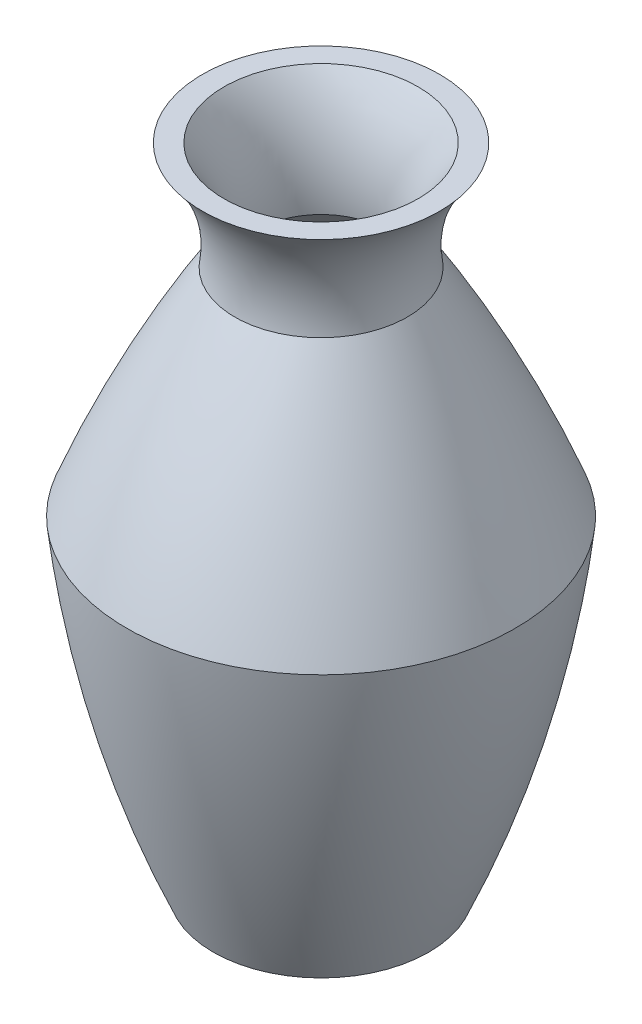
ISO-10303-21;
HEADER;
FILE_DESCRIPTION(('STEP AP214'),'2;1');
FILE_NAME('part.step','',(''),(''),'','','');
FILE_SCHEMA(('AUTOMOTIVE_DESIGN { 1 0 10303 214 1 1 1 1 }'));
ENDSEC;
DATA;
#1=APPLICATION_CONTEXT('core data for automotive mechanical design processes');
#2=APPLICATION_PROTOCOL_DEFINITION('international standard','automotive_design',2000,#1);
#3=PRODUCT_CONTEXT('',#1,'mechanical');
#4=PRODUCT('Part','Part','',(#3));
#5=PRODUCT_RELATED_PRODUCT_CATEGORY('part','',(#4));
#6=PRODUCT_DEFINITION_FORMATION('','',#4);
#7=PRODUCT_DEFINITION_CONTEXT('part definition',#1,'design');
#8=PRODUCT_DEFINITION('design','',#6,#7);
#9=PRODUCT_DEFINITION_SHAPE('','',#8);
#10=(LENGTH_UNIT() NAMED_UNIT(*) SI_UNIT(.MILLI.,.METRE.));
#11=(NAMED_UNIT(*) PLANE_ANGLE_UNIT() SI_UNIT($,.RADIAN.));
#12=(NAMED_UNIT(*) SI_UNIT($,.STERADIAN.) SOLID_ANGLE_UNIT());
#13=UNCERTAINTY_MEASURE_WITH_UNIT(LENGTH_MEASURE(1.E-05),#10,'distance_accuracy_value','');
#14=(GEOMETRIC_REPRESENTATION_CONTEXT(3) GLOBAL_UNCERTAINTY_ASSIGNED_CONTEXT((#13)) GLOBAL_UNIT_ASSIGNED_CONTEXT((#10,
#11,#12)) REPRESENTATION_CONTEXT('',''));
#15=CARTESIAN_POINT('',(0.,0.,0.));
#16=DIRECTION('',(0.,0.,1.));
#17=DIRECTION('',(1.,0.,0.));
#18=AXIS2_PLACEMENT_3D('',#15,#16,#17);
#19=CARTESIAN_POINT('',(0.,0.,0.));
#20=DIRECTION('',(0.,-1.,0.));
#21=DIRECTION('',(0.,0.,-1.));
#22=AXIS2_PLACEMENT_3D('',#19,#20,#21);
#23=PLANE('',#22);
#24=CARTESIAN_POINT('',(0.,0.,0.));
#25=DIRECTION('',(0.,-1.,0.));
#26=DIRECTION('',(0.,0.,-1.));
#27=AXIS2_PLACEMENT_3D('',#24,#25,#26);
#28=CIRCLE('',#27,25.);
#29=CARTESIAN_POINT('',(0.,0.,-25.));
#30=VERTEX_POINT('',#29);
#31=EDGE_CURVE('E10',#30,#30,#28,.T.);
#32=ORIENTED_EDGE('',*,*,#31,.T.);
#33=EDGE_LOOP('',(#32));
#34=FACE_BOUND('',#33,.T.);
#35=ADVANCED_FACE('F49',(#34),#23,.T.);
#36=CARTESIAN_POINT('',(0.,104.044444444445,0.));
#37=DIRECTION('',(0.,-1.,0.));
#38=DIRECTION('',(0.,0.,-1.));
#39=AXIS2_PLACEMENT_3D('',#36,#37,#38);
#40=DEGENERATE_TOROIDAL_SURFACE('',#39,214.541666666668,261.161743923566,.F.);
#41=CARTESIAN_POINT('',(0.,74.9999999999999,0.));
#42=DIRECTION('',(0.,-1.,0.));
#43=DIRECTION('',(0.,0.,-1.));
#44=AXIS2_PLACEMENT_3D('',#41,#42,#43);
#45=CIRCLE('',#44,45.);
#46=CARTESIAN_POINT('',(0.,74.9999999999999,-45.));
#47=VERTEX_POINT('',#46);
#48=EDGE_CURVE('E57',#47,#47,#45,.T.);
#49=ORIENTED_EDGE('',*,*,#48,.T.);
#50=EDGE_LOOP('',(#49));
#51=FACE_BOUND('',#50,.T.);
#52=ORIENTED_EDGE('',*,*,#31,.F.);
#53=EDGE_LOOP('',(#52));
#54=FACE_BOUND('',#53,.T.);
#55=ADVANCED_FACE('F120',(#51,#54),#40,.F.);
#56=CARTESIAN_POINT('',(0.,-29.8333333333408,0.));
#57=DIRECTION('',(0.,-1.,0.));
#58=DIRECTION('',(0.,0.,-1.));
#59=AXIS2_PLACEMENT_3D('',#56,#57,#58);
#60=DEGENERATE_TOROIDAL_SURFACE('',#59,227.166666666683,291.658571316244,.F.);
#61=CARTESIAN_POINT('',(0.,125.,0.));
#62=DIRECTION('',(0.,-1.,0.));
#63=DIRECTION('',(0.,0.,-1.));
#64=AXIS2_PLACEMENT_3D('',#61,#62,#63);
#65=CIRCLE('',#64,20.);
#66=CARTESIAN_POINT('',(0.,125.,-20.));
#67=VERTEX_POINT('',#66);
#68=EDGE_CURVE('E63',#67,#67,#65,.T.);
#69=ORIENTED_EDGE('',*,*,#68,.T.);
#70=EDGE_LOOP('',(#69));
#71=FACE_BOUND('',#70,.T.);
#72=ORIENTED_EDGE('',*,*,#48,.F.);
#73=EDGE_LOOP('',(#72));
#74=FACE_BOUND('',#73,.T.);
#75=ADVANCED_FACE('F123',(#71,#74),#60,.F.);
#76=CARTESIAN_POINT('',(0.,129.55,0.));
#77=DIRECTION('',(0.,-1.,0.));
#78=DIRECTION('',(0.,0.,-1.));
#79=AXIS2_PLACEMENT_3D('',#76,#77,#78);
#80=TOROIDAL_SURFACE('',#79,50.25,30.5902762328162);
#81=CARTESIAN_POINT('',(0.,150.,0.));
#82=DIRECTION('',(0.,-1.,0.));
#83=DIRECTION('',(0.,0.,-1.));
#84=AXIS2_PLACEMENT_3D('',#81,#82,#83);
#85=CIRCLE('',#84,27.5);
#86=CARTESIAN_POINT('',(0.,150.,-27.5));
#87=VERTEX_POINT('',#86);
#88=EDGE_CURVE('E70',#87,#87,#85,.T.);
#89=ORIENTED_EDGE('',*,*,#88,.T.);
#90=EDGE_LOOP('',(#89));
#91=FACE_BOUND('',#90,.T.);
#92=ORIENTED_EDGE('',*,*,#68,.F.);
#93=EDGE_LOOP('',(#92));
#94=FACE_BOUND('',#93,.T.);
#95=ADVANCED_FACE('F116',(#91,#94),#80,.F.);
#96=CARTESIAN_POINT('',(27.5,150.,0.));
#97=DIRECTION('',(0.,1.,0.));
#98=DIRECTION('',(0.,0.,1.));
#99=AXIS2_PLACEMENT_3D('',#96,#97,#98);
#100=PLANE('',#99);
#101=CARTESIAN_POINT('',(0.,150.,0.));
#102=DIRECTION('',(0.,-1.,0.));
#103=DIRECTION('',(0.,0.,-1.));
#104=AXIS2_PLACEMENT_3D('',#101,#102,#103);
#105=CIRCLE('',#104,22.5);
#106=CARTESIAN_POINT('',(0.,150.,-22.5));
#107=VERTEX_POINT('',#106);
#108=EDGE_CURVE('E85',#107,#107,#105,.T.);
#109=ORIENTED_EDGE('',*,*,#108,.T.);
#110=EDGE_LOOP('',(#109));
#111=FACE_BOUND('',#110,.T.);
#112=ORIENTED_EDGE('',*,*,#88,.F.);
#113=EDGE_LOOP('',(#112));
#114=FACE_BOUND('',#113,.T.);
#115=ADVANCED_FACE('F90',(#111,#114),#100,.T.);
#116=CARTESIAN_POINT('',(0.,9.99999999999995,0.));
#117=DIRECTION('',(0.,-1.,0.));
#118=DIRECTION('',(0.,0.,-1.));
#119=AXIS2_PLACEMENT_3D('',#116,#117,#118);
#120=PLANE('',#119);
#121=CARTESIAN_POINT('',(0.,9.9999999999999,0.));
#122=DIRECTION('',(0.,-1.,0.));
#123=DIRECTION('',(0.,0.,-1.));
#124=AXIS2_PLACEMENT_3D('',#121,#122,#123);
#125=CIRCLE('',#124,25.9999999999999);
#126=CARTESIAN_POINT('',(0.,9.9999999999999,-25.9999999999999));
#127=VERTEX_POINT('',#126);
#128=EDGE_CURVE('E75',#127,#127,#125,.T.);
#129=ORIENTED_EDGE('',*,*,#128,.F.);
#130=EDGE_LOOP('',(#129));
#131=FACE_BOUND('',#130,.T.);
#132=ADVANCED_FACE('F108',(#131),#120,.F.);
#133=CARTESIAN_POINT('',(0.,80.4801980198027,0.));
#134=DIRECTION('',(0.,-1.,0.));
#135=DIRECTION('',(0.,0.,-1.));
#136=AXIS2_PLACEMENT_3D('',#133,#134,#135);
#137=DEGENERATE_TOROIDAL_SURFACE('',#136,143.336633663369,183.418520911473,.F.);
#138=CARTESIAN_POINT('',(0.,75.,0.));
#139=DIRECTION('',(0.,-1.,0.));
#140=DIRECTION('',(0.,0.,-1.));
#141=AXIS2_PLACEMENT_3D('',#138,#139,#140);
#142=CIRCLE('',#141,40.);
#143=CARTESIAN_POINT('',(0.,75.,-40.));
#144=VERTEX_POINT('',#143);
#145=EDGE_CURVE('E78',#144,#144,#142,.T.);
#146=ORIENTED_EDGE('',*,*,#145,.F.);
#147=EDGE_LOOP('',(#146));
#148=FACE_BOUND('',#147,.T.);
#149=ORIENTED_EDGE('',*,*,#128,.T.);
#150=EDGE_LOOP('',(#149));
#151=FACE_BOUND('',#150,.T.);
#152=ADVANCED_FACE('F102',(#148,#151),#137,.T.);
#153=CARTESIAN_POINT('',(0.,62.5,0.));
#154=DIRECTION('',(0.,-1.,0.));
#155=DIRECTION('',(0.,0.,-1.));
#156=AXIS2_PLACEMENT_3D('',#153,#154,#155);
#157=DEGENERATE_TOROIDAL_SURFACE('',#156,47.5,88.3883476483185,.F.);
#158=CARTESIAN_POINT('',(0.,125.,0.));
#159=DIRECTION('',(0.,-1.,0.));
#160=DIRECTION('',(0.,0.,-1.));
#161=AXIS2_PLACEMENT_3D('',#158,#159,#160);
#162=CIRCLE('',#161,15.);
#163=CARTESIAN_POINT('',(0.,125.,-15.));
#164=VERTEX_POINT('',#163);
#165=EDGE_CURVE('E81',#164,#164,#162,.T.);
#166=ORIENTED_EDGE('',*,*,#165,.F.);
#167=EDGE_LOOP('',(#166));
#168=FACE_BOUND('',#167,.T.);
#169=ORIENTED_EDGE('',*,*,#145,.T.);
#170=EDGE_LOOP('',(#169));
#171=FACE_BOUND('',#170,.T.);
#172=ADVANCED_FACE('F96',(#168,#171),#157,.T.);
#173=CARTESIAN_POINT('',(0.,127.84,0.));
#174=DIRECTION('',(0.,-1.,0.));
#175=DIRECTION('',(0.,0.,-1.));
#176=AXIS2_PLACEMENT_3D('',#173,#174,#175);
#177=TOROIDAL_SURFACE('',#176,50.9500000000001,36.0620035494425);
#178=ORIENTED_EDGE('',*,*,#108,.F.);
#179=EDGE_LOOP('',(#178));
#180=FACE_BOUND('',#179,.T.);
#181=ORIENTED_EDGE('',*,*,#165,.T.);
#182=EDGE_LOOP('',(#181));
#183=FACE_BOUND('',#182,.T.);
#184=ADVANCED_FACE('F93',(#180,#183),#177,.T.);
#185=CLOSED_SHELL('',(#35,#55,#75,#95,#115,#132,#152,#172,#184));
#186=MANIFOLD_SOLID_BREP('B2',#185);
#187=ADVANCED_BREP_SHAPE_REPRESENTATION('',(#18,#186),#14);
#188=SHAPE_DEFINITION_REPRESENTATION(#9,#187);
ENDSEC;
END-ISO-10303-21;
